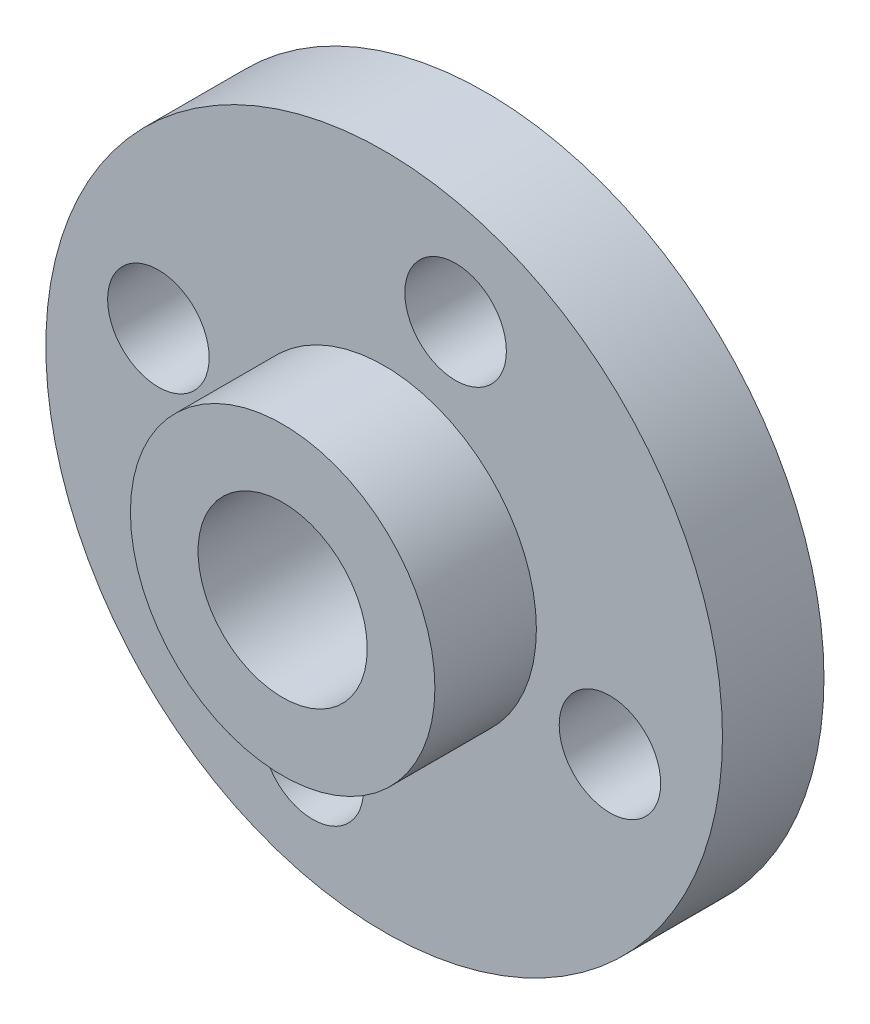
ISO-10303-21;
HEADER;
FILE_DESCRIPTION(('STEP AP214'),'2;1');
FILE_NAME('part.step','',(''),(''),'','','');
FILE_SCHEMA(('AUTOMOTIVE_DESIGN { 1 0 10303 214 1 1 1 1 }'));
ENDSEC;
DATA;
#1=APPLICATION_CONTEXT('core data for automotive mechanical design processes');
#2=APPLICATION_PROTOCOL_DEFINITION('international standard','automotive_design',2000,#1);
#3=PRODUCT_CONTEXT('',#1,'mechanical');
#4=PRODUCT('Part','Part','',(#3));
#5=PRODUCT_RELATED_PRODUCT_CATEGORY('part','',(#4));
#6=PRODUCT_DEFINITION_FORMATION('','',#4);
#7=PRODUCT_DEFINITION_CONTEXT('part definition',#1,'design');
#8=PRODUCT_DEFINITION('design','',#6,#7);
#9=PRODUCT_DEFINITION_SHAPE('','',#8);
#10=(LENGTH_UNIT() NAMED_UNIT(*) SI_UNIT(.MILLI.,.METRE.));
#11=(NAMED_UNIT(*) PLANE_ANGLE_UNIT() SI_UNIT($,.RADIAN.));
#12=(NAMED_UNIT(*) SI_UNIT($,.STERADIAN.) SOLID_ANGLE_UNIT());
#13=UNCERTAINTY_MEASURE_WITH_UNIT(LENGTH_MEASURE(1.E-05),#10,'distance_accuracy_value','');
#14=(GEOMETRIC_REPRESENTATION_CONTEXT(3) GLOBAL_UNCERTAINTY_ASSIGNED_CONTEXT((#13)) GLOBAL_UNIT_ASSIGNED_CONTEXT((#10,
#11,#12)) REPRESENTATION_CONTEXT('',''));
#15=CARTESIAN_POINT('',(0.,0.,0.));
#16=DIRECTION('',(0.,0.,1.));
#17=DIRECTION('',(1.,0.,0.));
#18=AXIS2_PLACEMENT_3D('',#15,#16,#17);
#19=CARTESIAN_POINT('',(0.,0.,3.));
#20=DIRECTION('',(0.,0.,-1.));
#21=DIRECTION('',(-1.,0.,0.));
#22=AXIS2_PLACEMENT_3D('',#19,#20,#21);
#23=CYLINDRICAL_SURFACE('',#22,10.);
#24=CARTESIAN_POINT('',(0.,0.,3.));
#25=DIRECTION('',(0.,0.,1.));
#26=DIRECTION('',(1.,0.,0.));
#27=AXIS2_PLACEMENT_3D('',#24,#25,#26);
#28=CIRCLE('',#27,10.);
#29=CARTESIAN_POINT('',(10.,0.,3.));
#30=VERTEX_POINT('',#29);
#31=EDGE_CURVE('E45',#30,#30,#28,.T.);
#32=ORIENTED_EDGE('',*,*,#31,.F.);
#33=EDGE_LOOP('',(#32));
#34=FACE_BOUND('',#33,.T.);
#35=CARTESIAN_POINT('',(0.,0.,0.));
#36=DIRECTION('',(0.,0.,1.));
#37=DIRECTION('',(1.,0.,0.));
#38=AXIS2_PLACEMENT_3D('',#35,#36,#37);
#39=CIRCLE('',#38,10.);
#40=CARTESIAN_POINT('',(10.,0.,0.));
#41=VERTEX_POINT('',#40);
#42=EDGE_CURVE('E40',#41,#41,#39,.T.);
#43=ORIENTED_EDGE('',*,*,#42,.T.);
#44=EDGE_LOOP('',(#43));
#45=FACE_BOUND('',#44,.T.);
#46=ADVANCED_FACE('F37',(#34,#45),#23,.T.);
#47=CARTESIAN_POINT('',(0.,0.,3.));
#48=DIRECTION('',(0.,0.,1.));
#49=DIRECTION('',(1.,0.,0.));
#50=AXIS2_PLACEMENT_3D('',#47,#48,#49);
#51=PLANE('',#50);
#52=CARTESIAN_POINT('',(-6.67370327622568,2.11227000662665,3.));
#53=DIRECTION('',(0.,0.,1.));
#54=DIRECTION('',(1.,0.,0.));
#55=AXIS2_PLACEMENT_3D('',#52,#53,#54);
#56=CIRCLE('',#55,1.49999999999999);
#57=CARTESIAN_POINT('',(-5.17370327622569,2.11227000662665,3.));
#58=VERTEX_POINT('',#57);
#59=EDGE_CURVE('E80',#58,#58,#56,.T.);
#60=ORIENTED_EDGE('',*,*,#59,.F.);
#61=EDGE_LOOP('',(#60));
#62=FACE_BOUND('',#61,.T.);
#63=CARTESIAN_POINT('',(-2.1122700066269,-6.67370327622581,3.));
#64=DIRECTION('',(0.,0.,1.));
#65=DIRECTION('',(1.,0.,0.));
#66=AXIS2_PLACEMENT_3D('',#63,#64,#65);
#67=CIRCLE('',#66,1.49999999999999);
#68=CARTESIAN_POINT('',(-0.612270006626904,-6.67370327622581,3.));
#69=VERTEX_POINT('',#68);
#70=EDGE_CURVE('E72',#69,#69,#67,.T.);
#71=ORIENTED_EDGE('',*,*,#70,.F.);
#72=EDGE_LOOP('',(#71));
#73=FACE_BOUND('',#72,.T.);
#74=CARTESIAN_POINT('',(6.67370327622557,-2.11227000662703,3.));
#75=DIRECTION('',(0.,0.,1.));
#76=DIRECTION('',(1.,0.,0.));
#77=AXIS2_PLACEMENT_3D('',#74,#75,#76);
#78=CIRCLE('',#77,1.49999999999999);
#79=CARTESIAN_POINT('',(8.17370327622557,-2.11227000662703,3.));
#80=VERTEX_POINT('',#79);
#81=EDGE_CURVE('E64',#80,#80,#78,.T.);
#82=ORIENTED_EDGE('',*,*,#81,.F.);
#83=EDGE_LOOP('',(#82));
#84=FACE_BOUND('',#83,.T.);
#85=CARTESIAN_POINT('',(2.11227000662678,6.67370327622544,3.));
#86=DIRECTION('',(0.,0.,1.));
#87=DIRECTION('',(1.,0.,0.));
#88=AXIS2_PLACEMENT_3D('',#85,#86,#87);
#89=CIRCLE('',#88,1.49999999999999);
#90=CARTESIAN_POINT('',(3.61227000662678,6.67370327622544,3.));
#91=VERTEX_POINT('',#90);
#92=EDGE_CURVE('E56',#91,#91,#89,.T.);
#93=ORIENTED_EDGE('',*,*,#92,.F.);
#94=EDGE_LOOP('',(#93));
#95=FACE_BOUND('',#94,.T.);
#96=CARTESIAN_POINT('',(0.,0.,3.));
#97=DIRECTION('',(0.,0.,1.));
#98=DIRECTION('',(1.,0.,0.));
#99=AXIS2_PLACEMENT_3D('',#96,#97,#98);
#100=CIRCLE('',#99,4.5);
#101=CARTESIAN_POINT('',(4.5,0.,3.));
#102=VERTEX_POINT('',#101);
#103=EDGE_CURVE('E10',#102,#102,#100,.T.);
#104=ORIENTED_EDGE('',*,*,#103,.F.);
#105=EDGE_LOOP('',(#104));
#106=FACE_BOUND('',#105,.T.);
#107=ORIENTED_EDGE('',*,*,#31,.T.);
#108=EDGE_LOOP('',(#107));
#109=FACE_BOUND('',#108,.T.);
#110=ADVANCED_FACE('F113',(#62,#73,#84,#95,#106,#109),#51,.T.);
#111=CARTESIAN_POINT('',(0.,0.,0.));
#112=DIRECTION('',(0.,0.,1.));
#113=DIRECTION('',(1.,0.,0.));
#114=AXIS2_PLACEMENT_3D('',#111,#112,#113);
#115=PLANE('',#114);
#116=CARTESIAN_POINT('',(0.,0.,0.));
#117=DIRECTION('',(0.,0.,1.));
#118=DIRECTION('',(1.,0.,0.));
#119=AXIS2_PLACEMENT_3D('',#116,#117,#118);
#120=CIRCLE('',#119,2.5);
#121=CARTESIAN_POINT('',(2.5,0.,0.));
#122=VERTEX_POINT('',#121);
#123=EDGE_CURVE('E88',#122,#122,#120,.T.);
#124=ORIENTED_EDGE('',*,*,#123,.T.);
#125=EDGE_LOOP('',(#124));
#126=FACE_BOUND('',#125,.T.);
#127=CARTESIAN_POINT('',(-6.67370327622568,2.11227000662665,0.));
#128=DIRECTION('',(0.,0.,-1.));
#129=DIRECTION('',(-1.,0.,0.));
#130=AXIS2_PLACEMENT_3D('',#127,#128,#129);
#131=CIRCLE('',#130,1.49999999999999);
#132=CARTESIAN_POINT('',(-8.17370327622567,2.11227000662665,0.));
#133=VERTEX_POINT('',#132);
#134=EDGE_CURVE('E84',#133,#133,#131,.T.);
#135=ORIENTED_EDGE('',*,*,#134,.F.);
#136=EDGE_LOOP('',(#135));
#137=FACE_BOUND('',#136,.T.);
#138=CARTESIAN_POINT('',(-2.1122700066269,-6.67370327622581,0.));
#139=DIRECTION('',(0.,0.,-1.));
#140=DIRECTION('',(-1.,0.,0.));
#141=AXIS2_PLACEMENT_3D('',#138,#139,#140);
#142=CIRCLE('',#141,1.49999999999999);
#143=CARTESIAN_POINT('',(-3.61227000662688,-6.67370327622581,0.));
#144=VERTEX_POINT('',#143);
#145=EDGE_CURVE('E76',#144,#144,#142,.T.);
#146=ORIENTED_EDGE('',*,*,#145,.F.);
#147=EDGE_LOOP('',(#146));
#148=FACE_BOUND('',#147,.T.);
#149=CARTESIAN_POINT('',(6.67370327622557,-2.11227000662703,0.));
#150=DIRECTION('',(0.,0.,-1.));
#151=DIRECTION('',(-1.,0.,0.));
#152=AXIS2_PLACEMENT_3D('',#149,#150,#151);
#153=CIRCLE('',#152,1.49999999999999);
#154=CARTESIAN_POINT('',(5.17370327622558,-2.11227000662703,0.));
#155=VERTEX_POINT('',#154);
#156=EDGE_CURVE('E68',#155,#155,#153,.T.);
#157=ORIENTED_EDGE('',*,*,#156,.F.);
#158=EDGE_LOOP('',(#157));
#159=FACE_BOUND('',#158,.T.);
#160=CARTESIAN_POINT('',(2.11227000662678,6.67370327622544,0.));
#161=DIRECTION('',(0.,0.,-1.));
#162=DIRECTION('',(-1.,0.,0.));
#163=AXIS2_PLACEMENT_3D('',#160,#161,#162);
#164=CIRCLE('',#163,1.49999999999999);
#165=CARTESIAN_POINT('',(0.612270006626796,6.67370327622544,0.));
#166=VERTEX_POINT('',#165);
#167=EDGE_CURVE('E60',#166,#166,#164,.T.);
#168=ORIENTED_EDGE('',*,*,#167,.F.);
#169=EDGE_LOOP('',(#168));
#170=FACE_BOUND('',#169,.T.);
#171=ORIENTED_EDGE('',*,*,#42,.F.);
#172=EDGE_LOOP('',(#171));
#173=FACE_BOUND('',#172,.T.);
#174=ADVANCED_FACE('F108',(#126,#137,#148,#159,#170,#173),#115,.F.);
#175=CARTESIAN_POINT('',(0.,0.,6.));
#176=DIRECTION('',(0.,0.,-1.));
#177=DIRECTION('',(-1.,0.,0.));
#178=AXIS2_PLACEMENT_3D('',#175,#176,#177);
#179=CYLINDRICAL_SURFACE('',#178,4.5);
#180=CARTESIAN_POINT('',(0.,0.,6.));
#181=DIRECTION('',(0.,0.,1.));
#182=DIRECTION('',(1.,0.,0.));
#183=AXIS2_PLACEMENT_3D('',#180,#181,#182);
#184=CIRCLE('',#183,4.5);
#185=CARTESIAN_POINT('',(4.5,0.,6.));
#186=VERTEX_POINT('',#185);
#187=EDGE_CURVE('E52',#186,#186,#184,.T.);
#188=ORIENTED_EDGE('',*,*,#187,.F.);
#189=EDGE_LOOP('',(#188));
#190=FACE_BOUND('',#189,.T.);
#191=ORIENTED_EDGE('',*,*,#103,.T.);
#192=EDGE_LOOP('',(#191));
#193=FACE_BOUND('',#192,.T.);
#194=ADVANCED_FACE('F103',(#190,#193),#179,.T.);
#195=CARTESIAN_POINT('',(0.,0.,6.));
#196=DIRECTION('',(0.,0.,1.));
#197=DIRECTION('',(1.,0.,0.));
#198=AXIS2_PLACEMENT_3D('',#195,#196,#197);
#199=PLANE('',#198);
#200=CARTESIAN_POINT('',(0.,0.,6.));
#201=DIRECTION('',(0.,0.,1.));
#202=DIRECTION('',(1.,0.,0.));
#203=AXIS2_PLACEMENT_3D('',#200,#201,#202);
#204=CIRCLE('',#203,2.5);
#205=CARTESIAN_POINT('',(2.5,0.,6.));
#206=VERTEX_POINT('',#205);
#207=EDGE_CURVE('E92',#206,#206,#204,.T.);
#208=ORIENTED_EDGE('',*,*,#207,.F.);
#209=EDGE_LOOP('',(#208));
#210=FACE_BOUND('',#209,.T.);
#211=ORIENTED_EDGE('',*,*,#187,.T.);
#212=EDGE_LOOP('',(#211));
#213=FACE_BOUND('',#212,.T.);
#214=ADVANCED_FACE('F99',(#210,#213),#199,.T.);
#215=CARTESIAN_POINT('',(2.11227000662678,6.67370327622544,0.));
#216=DIRECTION('',(0.,0.,-1.));
#217=DIRECTION('',(-1.,0.,0.));
#218=AXIS2_PLACEMENT_3D('',#215,#216,#217);
#219=CYLINDRICAL_SURFACE('',#218,1.49999999999999);
#220=ORIENTED_EDGE('',*,*,#92,.T.);
#221=EDGE_LOOP('',(#220));
#222=FACE_BOUND('',#221,.T.);
#223=ORIENTED_EDGE('',*,*,#167,.T.);
#224=EDGE_LOOP('',(#223));
#225=FACE_BOUND('',#224,.T.);
#226=ADVANCED_FACE('F102',(#222,#225),#219,.F.);
#227=CARTESIAN_POINT('',(6.67370327622557,-2.11227000662703,0.));
#228=DIRECTION('',(0.,0.,-1.));
#229=DIRECTION('',(-1.,0.,0.));
#230=AXIS2_PLACEMENT_3D('',#227,#228,#229);
#231=CYLINDRICAL_SURFACE('',#230,1.49999999999999);
#232=ORIENTED_EDGE('',*,*,#81,.T.);
#233=EDGE_LOOP('',(#232));
#234=FACE_BOUND('',#233,.T.);
#235=ORIENTED_EDGE('',*,*,#156,.T.);
#236=EDGE_LOOP('',(#235));
#237=FACE_BOUND('',#236,.T.);
#238=ADVANCED_FACE('F142',(#234,#237),#231,.F.);
#239=CARTESIAN_POINT('',(-2.1122700066269,-6.67370327622581,0.));
#240=DIRECTION('',(0.,0.,-1.));
#241=DIRECTION('',(-1.,0.,0.));
#242=AXIS2_PLACEMENT_3D('',#239,#240,#241);
#243=CYLINDRICAL_SURFACE('',#242,1.49999999999999);
#244=ORIENTED_EDGE('',*,*,#70,.T.);
#245=EDGE_LOOP('',(#244));
#246=FACE_BOUND('',#245,.T.);
#247=ORIENTED_EDGE('',*,*,#145,.T.);
#248=EDGE_LOOP('',(#247));
#249=FACE_BOUND('',#248,.T.);
#250=ADVANCED_FACE('F149',(#246,#249),#243,.F.);
#251=CARTESIAN_POINT('',(-6.67370327622568,2.11227000662665,0.));
#252=DIRECTION('',(0.,0.,-1.));
#253=DIRECTION('',(-1.,0.,0.));
#254=AXIS2_PLACEMENT_3D('',#251,#252,#253);
#255=CYLINDRICAL_SURFACE('',#254,1.49999999999999);
#256=ORIENTED_EDGE('',*,*,#59,.T.);
#257=EDGE_LOOP('',(#256));
#258=FACE_BOUND('',#257,.T.);
#259=ORIENTED_EDGE('',*,*,#134,.T.);
#260=EDGE_LOOP('',(#259));
#261=FACE_BOUND('',#260,.T.);
#262=ADVANCED_FACE('F155',(#258,#261),#255,.F.);
#263=CARTESIAN_POINT('',(0.,0.,6.));
#264=DIRECTION('',(0.,0.,1.));
#265=DIRECTION('',(1.,0.,0.));
#266=AXIS2_PLACEMENT_3D('',#263,#264,#265);
#267=CYLINDRICAL_SURFACE('',#266,2.5);
#268=ORIENTED_EDGE('',*,*,#123,.F.);
#269=EDGE_LOOP('',(#268));
#270=FACE_BOUND('',#269,.T.);
#271=ORIENTED_EDGE('',*,*,#207,.T.);
#272=EDGE_LOOP('',(#271));
#273=FACE_BOUND('',#272,.T.);
#274=ADVANCED_FACE('F97',(#270,#273),#267,.F.);
#275=CLOSED_SHELL('',(#46,#110,#174,#194,#214,#226,#238,#250,#262,#274));
#276=MANIFOLD_SOLID_BREP('B2',#275);
#277=ADVANCED_BREP_SHAPE_REPRESENTATION('',(#18,#276),#14);
#278=SHAPE_DEFINITION_REPRESENTATION(#9,#277);
ENDSEC;
END-ISO-10303-21;
